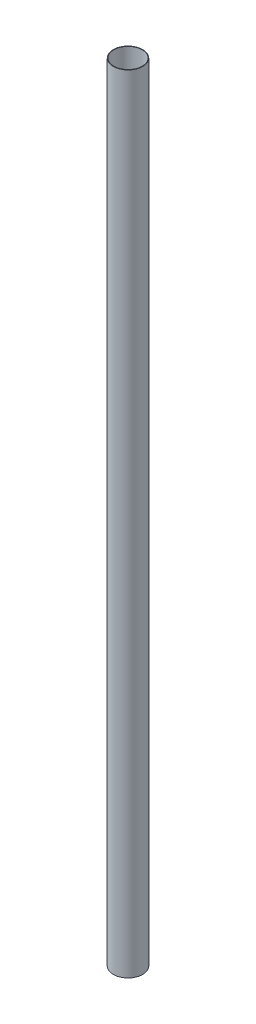
ISO-10303-21;
HEADER;
FILE_DESCRIPTION(('STEP AP214'),'2;1');
FILE_NAME('part.step','',(''),(''),'','','');
FILE_SCHEMA(('AUTOMOTIVE_DESIGN { 1 0 10303 214 1 1 1 1 }'));
ENDSEC;
DATA;
#1=APPLICATION_CONTEXT('core data for automotive mechanical design processes');
#2=APPLICATION_PROTOCOL_DEFINITION('international standard','automotive_design',2000,#1);
#3=PRODUCT_CONTEXT('',#1,'mechanical');
#4=PRODUCT('Part','Part','',(#3));
#5=PRODUCT_RELATED_PRODUCT_CATEGORY('part','',(#4));
#6=PRODUCT_DEFINITION_FORMATION('','',#4);
#7=PRODUCT_DEFINITION_CONTEXT('part definition',#1,'design');
#8=PRODUCT_DEFINITION('design','',#6,#7);
#9=PRODUCT_DEFINITION_SHAPE('','',#8);
#10=(LENGTH_UNIT() NAMED_UNIT(*) SI_UNIT(.MILLI.,.METRE.));
#11=(NAMED_UNIT(*) PLANE_ANGLE_UNIT() SI_UNIT($,.RADIAN.));
#12=(NAMED_UNIT(*) SI_UNIT($,.STERADIAN.) SOLID_ANGLE_UNIT());
#13=UNCERTAINTY_MEASURE_WITH_UNIT(LENGTH_MEASURE(1.E-05),#10,'distance_accuracy_value','');
#14=(GEOMETRIC_REPRESENTATION_CONTEXT(3) GLOBAL_UNCERTAINTY_ASSIGNED_CONTEXT((#13)) GLOBAL_UNIT_ASSIGNED_CONTEXT((#10,
#11,#12)) REPRESENTATION_CONTEXT('',''));
#15=CARTESIAN_POINT('',(0.,0.,0.));
#16=DIRECTION('',(0.,0.,1.));
#17=DIRECTION('',(1.,0.,0.));
#18=AXIS2_PLACEMENT_3D('',#15,#16,#17);
#19=CARTESIAN_POINT('',(0.,830.,0.));
#20=DIRECTION('',(0.,-1.,0.));
#21=DIRECTION('',(0.,0.,-1.));
#22=AXIS2_PLACEMENT_3D('',#19,#20,#21);
#23=CYLINDRICAL_SURFACE('',#22,15.5);
#24=CARTESIAN_POINT('',(0.,830.,0.));
#25=DIRECTION('',(0.,1.,0.));
#26=DIRECTION('',(0.,0.,1.));
#27=AXIS2_PLACEMENT_3D('',#24,#25,#26);
#28=CIRCLE('',#27,15.5);
#29=CARTESIAN_POINT('',(0.,830.,15.5));
#30=VERTEX_POINT('',#29);
#31=EDGE_CURVE('E10',#30,#30,#28,.T.);
#32=ORIENTED_EDGE('',*,*,#31,.F.);
#33=EDGE_LOOP('',(#32));
#34=FACE_BOUND('',#33,.T.);
#35=CARTESIAN_POINT('',(0.,0.,0.));
#36=DIRECTION('',(0.,1.,0.));
#37=DIRECTION('',(0.,0.,1.));
#38=AXIS2_PLACEMENT_3D('',#35,#36,#37);
#39=CIRCLE('',#38,15.5);
#40=CARTESIAN_POINT('',(0.,0.,15.5));
#41=VERTEX_POINT('',#40);
#42=EDGE_CURVE('E38',#41,#41,#39,.T.);
#43=ORIENTED_EDGE('',*,*,#42,.T.);
#44=EDGE_LOOP('',(#43));
#45=FACE_BOUND('',#44,.T.);
#46=ADVANCED_FACE('F31',(#34,#45),#23,.T.);
#47=CARTESIAN_POINT('',(0.,830.,0.));
#48=DIRECTION('',(0.,1.,0.));
#49=DIRECTION('',(0.,0.,1.));
#50=AXIS2_PLACEMENT_3D('',#47,#48,#49);
#51=PLANE('',#50);
#52=CARTESIAN_POINT('',(0.,830.,0.));
#53=DIRECTION('',(0.,1.,0.));
#54=DIRECTION('',(0.,0.,1.));
#55=AXIS2_PLACEMENT_3D('',#52,#53,#54);
#56=CIRCLE('',#55,15.);
#57=CARTESIAN_POINT('',(0.,830.,15.));
#58=VERTEX_POINT('',#57);
#59=EDGE_CURVE('E44',#58,#58,#56,.T.);
#60=ORIENTED_EDGE('',*,*,#59,.F.);
#61=EDGE_LOOP('',(#60));
#62=FACE_BOUND('',#61,.T.);
#63=ORIENTED_EDGE('',*,*,#31,.T.);
#64=EDGE_LOOP('',(#63));
#65=FACE_BOUND('',#64,.T.);
#66=ADVANCED_FACE('F60',(#62,#65),#51,.T.);
#67=CARTESIAN_POINT('',(0.,0.,0.));
#68=DIRECTION('',(0.,1.,0.));
#69=DIRECTION('',(0.,0.,1.));
#70=AXIS2_PLACEMENT_3D('',#67,#68,#69);
#71=PLANE('',#70);
#72=CARTESIAN_POINT('',(0.,0.,0.));
#73=DIRECTION('',(0.,1.,0.));
#74=DIRECTION('',(0.,0.,1.));
#75=AXIS2_PLACEMENT_3D('',#72,#73,#74);
#76=CIRCLE('',#75,15.);
#77=CARTESIAN_POINT('',(0.,0.,15.));
#78=VERTEX_POINT('',#77);
#79=EDGE_CURVE('E34',#78,#78,#76,.T.);
#80=ORIENTED_EDGE('',*,*,#79,.T.);
#81=EDGE_LOOP('',(#80));
#82=FACE_BOUND('',#81,.T.);
#83=ORIENTED_EDGE('',*,*,#42,.F.);
#84=EDGE_LOOP('',(#83));
#85=FACE_BOUND('',#84,.T.);
#86=ADVANCED_FACE('F51',(#82,#85),#71,.F.);
#87=CARTESIAN_POINT('',(0.,-101.000000000001,0.));
#88=DIRECTION('',(0.,1.,0.));
#89=DIRECTION('',(0.,0.,1.));
#90=AXIS2_PLACEMENT_3D('',#87,#88,#89);
#91=CYLINDRICAL_SURFACE('',#90,15.);
#92=ORIENTED_EDGE('',*,*,#59,.T.);
#93=EDGE_LOOP('',(#92));
#94=FACE_BOUND('',#93,.T.);
#95=ORIENTED_EDGE('',*,*,#79,.F.);
#96=EDGE_LOOP('',(#95));
#97=FACE_BOUND('',#96,.T.);
#98=ADVANCED_FACE('F54',(#94,#97),#91,.F.);
#99=CLOSED_SHELL('',(#46,#66,#86,#98));
#100=MANIFOLD_SOLID_BREP('B2',#99);
#101=ADVANCED_BREP_SHAPE_REPRESENTATION('',(#18,#100),#14);
#102=SHAPE_DEFINITION_REPRESENTATION(#9,#101);
ENDSEC;
END-ISO-10303-21;
